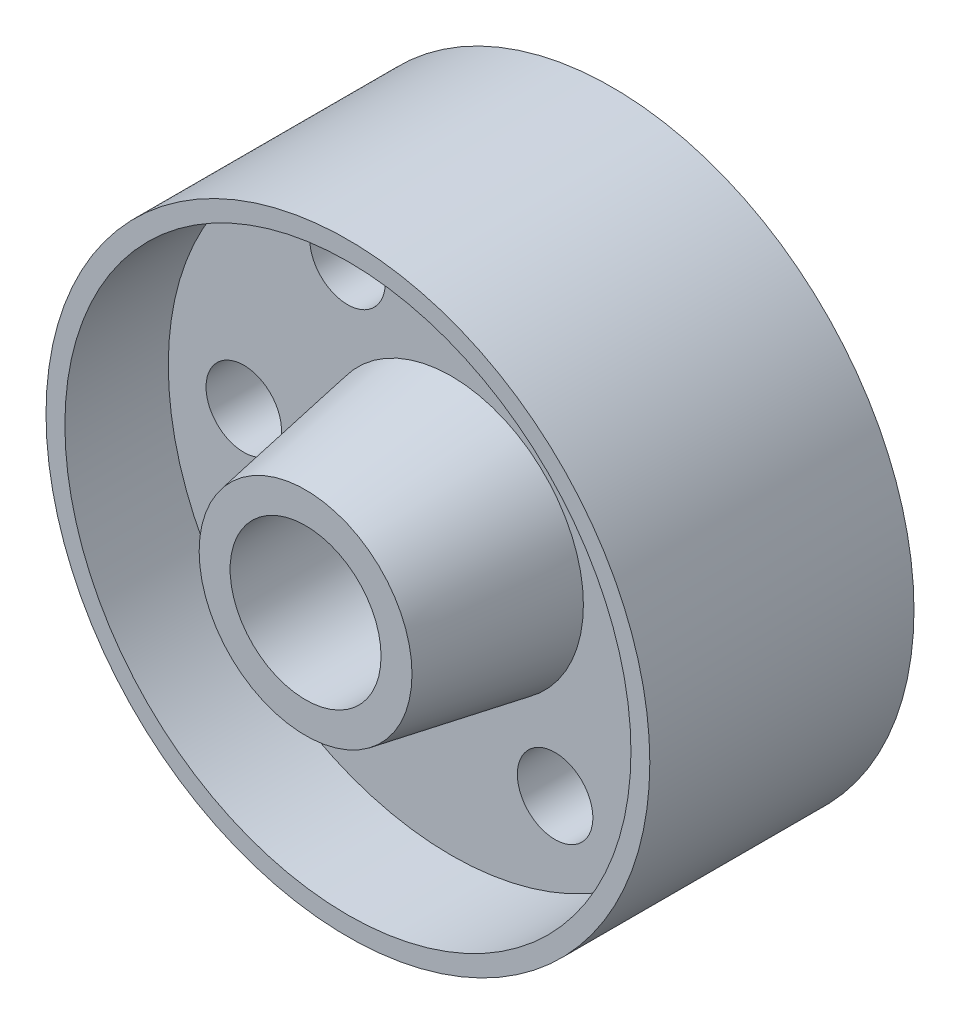
ISO-10303-21;
HEADER;
FILE_DESCRIPTION(('STEP AP214'),'2;1');
FILE_NAME('part.step','',(''),(''),'','','');
FILE_SCHEMA(('AUTOMOTIVE_DESIGN { 1 0 10303 214 1 1 1 1 }'));
ENDSEC;
DATA;
#1=APPLICATION_CONTEXT('core data for automotive mechanical design processes');
#2=APPLICATION_PROTOCOL_DEFINITION('international standard','automotive_design',2000,#1);
#3=PRODUCT_CONTEXT('',#1,'mechanical');
#4=PRODUCT('Part','Part','',(#3));
#5=PRODUCT_RELATED_PRODUCT_CATEGORY('part','',(#4));
#6=PRODUCT_DEFINITION_FORMATION('','',#4);
#7=PRODUCT_DEFINITION_CONTEXT('part definition',#1,'design');
#8=PRODUCT_DEFINITION('design','',#6,#7);
#9=PRODUCT_DEFINITION_SHAPE('','',#8);
#10=(LENGTH_UNIT() NAMED_UNIT(*) SI_UNIT(.MILLI.,.METRE.));
#11=(NAMED_UNIT(*) PLANE_ANGLE_UNIT() SI_UNIT($,.RADIAN.));
#12=(NAMED_UNIT(*) SI_UNIT($,.STERADIAN.) SOLID_ANGLE_UNIT());
#13=UNCERTAINTY_MEASURE_WITH_UNIT(LENGTH_MEASURE(1.E-05),#10,'distance_accuracy_value','');
#14=(GEOMETRIC_REPRESENTATION_CONTEXT(3) GLOBAL_UNCERTAINTY_ASSIGNED_CONTEXT((#13)) GLOBAL_UNIT_ASSIGNED_CONTEXT((#10,
#11,#12)) REPRESENTATION_CONTEXT('',''));
#15=CARTESIAN_POINT('',(0.,0.,0.));
#16=DIRECTION('',(0.,0.,1.));
#17=DIRECTION('',(1.,0.,0.));
#18=AXIS2_PLACEMENT_3D('',#15,#16,#17);
#19=CARTESIAN_POINT('',(0.,12.7,29.3497));
#20=DIRECTION('',(0.,0.,-1.));
#21=DIRECTION('',(-1.,0.,0.));
#22=AXIS2_PLACEMENT_3D('',#19,#20,#21);
#23=PLANE('',#22);
#24=CARTESIAN_POINT('',(0.,0.,29.3497));
#25=DIRECTION('',(0.,0.,1.));
#26=DIRECTION('',(1.,0.,0.));
#27=AXIS2_PLACEMENT_3D('',#24,#25,#26);
#28=CIRCLE('',#27,12.7);
#29=CARTESIAN_POINT('',(12.7,0.,29.3497));
#30=VERTEX_POINT('',#29);
#31=EDGE_CURVE('E10',#30,#30,#28,.T.);
#32=ORIENTED_EDGE('',*,*,#31,.F.);
#33=EDGE_LOOP('',(#32));
#34=FACE_BOUND('',#33,.T.);
#35=CARTESIAN_POINT('',(0.,0.,29.3497));
#36=DIRECTION('',(0.,0.,1.));
#37=DIRECTION('',(1.,0.,0.));
#38=AXIS2_PLACEMENT_3D('',#35,#36,#37);
#39=CIRCLE('',#38,17.907);
#40=CARTESIAN_POINT('',(17.907,0.,29.3497));
#41=VERTEX_POINT('',#40);
#42=EDGE_CURVE('E90',#41,#41,#39,.T.);
#43=ORIENTED_EDGE('',*,*,#42,.T.);
#44=EDGE_LOOP('',(#43));
#45=FACE_BOUND('',#44,.T.);
#46=ADVANCED_FACE('F37',(#34,#45),#23,.F.);
#47=CARTESIAN_POINT('',(0.,0.,50.3328850587005));
#48=DIRECTION('',(0.,0.,1.));
#49=DIRECTION('',(1.,0.,0.));
#50=AXIS2_PLACEMENT_3D('',#47,#48,#49);
#51=CYLINDRICAL_SURFACE('',#50,12.7);
#52=CARTESIAN_POINT('',(0.,0.,-29.3497));
#53=DIRECTION('',(0.,0.,1.));
#54=DIRECTION('',(1.,0.,0.));
#55=AXIS2_PLACEMENT_3D('',#52,#53,#54);
#56=CIRCLE('',#55,12.7);
#57=CARTESIAN_POINT('',(12.7,0.,-29.3497));
#58=VERTEX_POINT('',#57);
#59=EDGE_CURVE('E44',#58,#58,#56,.T.);
#60=ORIENTED_EDGE('',*,*,#59,.F.);
#61=EDGE_LOOP('',(#60));
#62=FACE_BOUND('',#61,.T.);
#63=ORIENTED_EDGE('',*,*,#31,.T.);
#64=EDGE_LOOP('',(#63));
#65=FACE_BOUND('',#64,.T.);
#66=ADVANCED_FACE('F206',(#62,#65),#51,.F.);
#67=CARTESIAN_POINT('',(0.,12.7,-29.3497));
#68=DIRECTION('',(0.,0.,1.));
#69=DIRECTION('',(1.,0.,0.));
#70=AXIS2_PLACEMENT_3D('',#67,#68,#69);
#71=PLANE('',#70);
#72=CARTESIAN_POINT('',(0.,0.,-29.3497));
#73=DIRECTION('',(0.,0.,1.));
#74=DIRECTION('',(1.,0.,0.));
#75=AXIS2_PLACEMENT_3D('',#72,#73,#74);
#76=CIRCLE('',#75,17.907);
#77=CARTESIAN_POINT('',(17.907,0.,-29.3497));
#78=VERTEX_POINT('',#77);
#79=EDGE_CURVE('E50',#78,#78,#76,.T.);
#80=ORIENTED_EDGE('',*,*,#79,.F.);
#81=EDGE_LOOP('',(#80));
#82=FACE_BOUND('',#81,.T.);
#83=ORIENTED_EDGE('',*,*,#59,.T.);
#84=EDGE_LOOP('',(#83));
#85=FACE_BOUND('',#84,.T.);
#86=ADVANCED_FACE('F201',(#82,#85),#71,.F.);
#87=CARTESIAN_POINT('',(0.,0.,-29.3497));
#88=DIRECTION('',(0.,0.,1.));
#89=DIRECTION('',(1.,0.,0.));
#90=AXIS2_PLACEMENT_3D('',#87,#88,#89);
#91=CONICAL_SURFACE('',#90,17.907,0.174288117720068);
#92=CARTESIAN_POINT('',(0.,0.,-4.826));
#93=DIRECTION('',(0.,0.,1.));
#94=DIRECTION('',(1.,0.,0.));
#95=AXIS2_PLACEMENT_3D('',#92,#93,#94);
#96=CIRCLE('',#95,22.225);
#97=CARTESIAN_POINT('',(22.225,0.,-4.826));
#98=VERTEX_POINT('',#97);
#99=EDGE_CURVE('E56',#98,#98,#96,.T.);
#100=ORIENTED_EDGE('',*,*,#99,.F.);
#101=EDGE_LOOP('',(#100));
#102=FACE_BOUND('',#101,.T.);
#103=ORIENTED_EDGE('',*,*,#79,.T.);
#104=EDGE_LOOP('',(#103));
#105=FACE_BOUND('',#104,.T.);
#106=ADVANCED_FACE('F194',(#102,#105),#91,.T.);
#107=CARTESIAN_POINT('',(0.,47.625,-4.826));
#108=DIRECTION('',(0.,0.,1.));
#109=DIRECTION('',(1.,0.,0.));
#110=AXIS2_PLACEMENT_3D('',#107,#108,#109);
#111=PLANE('',#110);
#112=CARTESIAN_POINT('',(17.4625000000004,-30.2459372271713,-4.826));
#113=DIRECTION('',(0.,0.,1.));
#114=DIRECTION('',(0.50000000000001,-0.866025403784433,0.));
#115=AXIS2_PLACEMENT_3D('',#112,#113,#114);
#116=CIRCLE('',#115,6.34999999999999);
#117=CARTESIAN_POINT('',(20.6375000000004,-35.7451985412025,-4.826));
#118=VERTEX_POINT('',#117);
#119=EDGE_CURVE('E111',#118,#118,#116,.T.);
#120=ORIENTED_EDGE('',*,*,#119,.T.);
#121=EDGE_LOOP('',(#120));
#122=FACE_BOUND('',#121,.T.);
#123=CARTESIAN_POINT('',(-17.4624999999997,-30.2459372271717,-4.826));
#124=DIRECTION('',(0.,0.,1.));
#125=DIRECTION('',(-0.499999999999992,-0.866025403784443,0.));
#126=AXIS2_PLACEMENT_3D('',#123,#124,#125);
#127=CIRCLE('',#126,6.34999999999999);
#128=CARTESIAN_POINT('',(-20.6374999999997,-35.7451985412029,-4.826));
#129=VERTEX_POINT('',#128);
#130=EDGE_CURVE('E120',#129,#129,#127,.T.);
#131=ORIENTED_EDGE('',*,*,#130,.T.);
#132=EDGE_LOOP('',(#131));
#133=FACE_BOUND('',#132,.T.);
#134=CARTESIAN_POINT('',(-34.925,0.,-4.826));
#135=DIRECTION('',(0.,0.,1.));
#136=DIRECTION('',(-1.,0.,0.));
#137=AXIS2_PLACEMENT_3D('',#134,#135,#136);
#138=CIRCLE('',#137,6.34999999999999);
#139=CARTESIAN_POINT('',(-41.275,0.,-4.826));
#140=VERTEX_POINT('',#139);
#141=EDGE_CURVE('E128',#140,#140,#138,.T.);
#142=ORIENTED_EDGE('',*,*,#141,.T.);
#143=EDGE_LOOP('',(#142));
#144=FACE_BOUND('',#143,.T.);
#145=CARTESIAN_POINT('',(-17.4625000000001,30.2459372271714,-4.826));
#146=DIRECTION('',(0.,0.,1.));
#147=DIRECTION('',(-0.500000000000004,0.866025403784436,0.));
#148=AXIS2_PLACEMENT_3D('',#145,#146,#147);
#149=CIRCLE('',#148,6.34999999999999);
#150=CARTESIAN_POINT('',(-20.6375000000002,35.7451985412026,-4.826));
#151=VERTEX_POINT('',#150);
#152=EDGE_CURVE('E110',#151,#151,#149,.T.);
#153=ORIENTED_EDGE('',*,*,#152,.T.);
#154=EDGE_LOOP('',(#153));
#155=FACE_BOUND('',#154,.T.);
#156=CARTESIAN_POINT('',(17.4624999999999,30.2459372271716,-4.826));
#157=DIRECTION('',(0.,0.,1.));
#158=DIRECTION('',(0.499999999999998,0.86602540378444,0.));
#159=AXIS2_PLACEMENT_3D('',#156,#157,#158);
#160=CIRCLE('',#159,6.34999999999999);
#161=CARTESIAN_POINT('',(20.6374999999999,35.7451985412027,-4.826));
#162=VERTEX_POINT('',#161);
#163=EDGE_CURVE('E102',#162,#162,#160,.T.);
#164=ORIENTED_EDGE('',*,*,#163,.T.);
#165=EDGE_LOOP('',(#164));
#166=FACE_BOUND('',#165,.T.);
#167=CARTESIAN_POINT('',(34.925,0.,-4.826));
#168=DIRECTION('',(0.,0.,1.));
#169=DIRECTION('',(1.,0.,0.));
#170=AXIS2_PLACEMENT_3D('',#167,#168,#169);
#171=CIRCLE('',#170,6.34999999999999);
#172=CARTESIAN_POINT('',(41.275,0.,-4.826));
#173=VERTEX_POINT('',#172);
#174=EDGE_CURVE('E94',#173,#173,#171,.T.);
#175=ORIENTED_EDGE('',*,*,#174,.T.);
#176=EDGE_LOOP('',(#175));
#177=FACE_BOUND('',#176,.T.);
#178=CARTESIAN_POINT('',(0.,0.,-4.826));
#179=DIRECTION('',(0.,0.,1.));
#180=DIRECTION('',(1.,0.,0.));
#181=AXIS2_PLACEMENT_3D('',#178,#179,#180);
#182=CIRCLE('',#181,47.625);
#183=CARTESIAN_POINT('',(47.625,0.,-4.826));
#184=VERTEX_POINT('',#183);
#185=EDGE_CURVE('E62',#184,#184,#182,.T.);
#186=ORIENTED_EDGE('',*,*,#185,.F.);
#187=EDGE_LOOP('',(#186));
#188=FACE_BOUND('',#187,.T.);
#189=ORIENTED_EDGE('',*,*,#99,.T.);
#190=EDGE_LOOP('',(#189));
#191=FACE_BOUND('',#190,.T.);
#192=ADVANCED_FACE('F188',(#122,#133,#144,#155,#166,#177,#188,#191),#111,.F.);
#193=CARTESIAN_POINT('',(0.,0.,50.3328850587005));
#194=DIRECTION('',(0.,0.,1.));
#195=DIRECTION('',(1.,0.,0.));
#196=AXIS2_PLACEMENT_3D('',#193,#194,#195);
#197=CYLINDRICAL_SURFACE('',#196,47.625);
#198=CARTESIAN_POINT('',(0.,0.,-22.225));
#199=DIRECTION('',(0.,0.,1.));
#200=DIRECTION('',(1.,0.,0.));
#201=AXIS2_PLACEMENT_3D('',#198,#199,#200);
#202=CIRCLE('',#201,47.625);
#203=CARTESIAN_POINT('',(47.625,0.,-22.225));
#204=VERTEX_POINT('',#203);
#205=EDGE_CURVE('E66',#204,#204,#202,.T.);
#206=ORIENTED_EDGE('',*,*,#205,.F.);
#207=EDGE_LOOP('',(#206));
#208=FACE_BOUND('',#207,.T.);
#209=ORIENTED_EDGE('',*,*,#185,.T.);
#210=EDGE_LOOP('',(#209));
#211=FACE_BOUND('',#210,.T.);
#212=ADVANCED_FACE('F182',(#208,#211),#197,.F.);
#213=CARTESIAN_POINT('',(0.,50.8,-22.225));
#214=DIRECTION('',(0.,0.,1.));
#215=DIRECTION('',(1.,0.,0.));
#216=AXIS2_PLACEMENT_3D('',#213,#214,#215);
#217=PLANE('',#216);
#218=CARTESIAN_POINT('',(0.,0.,-22.225));
#219=DIRECTION('',(0.,0.,1.));
#220=DIRECTION('',(1.,0.,0.));
#221=AXIS2_PLACEMENT_3D('',#218,#219,#220);
#222=CIRCLE('',#221,50.8);
#223=CARTESIAN_POINT('',(50.8,0.,-22.225));
#224=VERTEX_POINT('',#223);
#225=EDGE_CURVE('E70',#224,#224,#222,.T.);
#226=ORIENTED_EDGE('',*,*,#225,.F.);
#227=EDGE_LOOP('',(#226));
#228=FACE_BOUND('',#227,.T.);
#229=ORIENTED_EDGE('',*,*,#205,.T.);
#230=EDGE_LOOP('',(#229));
#231=FACE_BOUND('',#230,.T.);
#232=ADVANCED_FACE('F176',(#228,#231),#217,.F.);
#233=CARTESIAN_POINT('',(0.,0.,50.3328850587005));
#234=DIRECTION('',(0.,0.,1.));
#235=DIRECTION('',(1.,0.,0.));
#236=AXIS2_PLACEMENT_3D('',#233,#234,#235);
#237=CYLINDRICAL_SURFACE('',#236,50.8);
#238=CARTESIAN_POINT('',(0.,0.,22.225));
#239=DIRECTION('',(0.,0.,1.));
#240=DIRECTION('',(1.,0.,0.));
#241=AXIS2_PLACEMENT_3D('',#238,#239,#240);
#242=CIRCLE('',#241,50.8);
#243=CARTESIAN_POINT('',(50.8,0.,22.225));
#244=VERTEX_POINT('',#243);
#245=EDGE_CURVE('E74',#244,#244,#242,.T.);
#246=ORIENTED_EDGE('',*,*,#245,.F.);
#247=EDGE_LOOP('',(#246));
#248=FACE_BOUND('',#247,.T.);
#249=ORIENTED_EDGE('',*,*,#225,.T.);
#250=EDGE_LOOP('',(#249));
#251=FACE_BOUND('',#250,.T.);
#252=ADVANCED_FACE('F170',(#248,#251),#237,.T.);
#253=CARTESIAN_POINT('',(0.,47.625,22.225));
#254=DIRECTION('',(0.,0.,-1.));
#255=DIRECTION('',(-1.,0.,0.));
#256=AXIS2_PLACEMENT_3D('',#253,#254,#255);
#257=PLANE('',#256);
#258=CARTESIAN_POINT('',(0.,0.,22.225));
#259=DIRECTION('',(0.,0.,1.));
#260=DIRECTION('',(1.,0.,0.));
#261=AXIS2_PLACEMENT_3D('',#258,#259,#260);
#262=CIRCLE('',#261,47.625);
#263=CARTESIAN_POINT('',(47.625,0.,22.225));
#264=VERTEX_POINT('',#263);
#265=EDGE_CURVE('E78',#264,#264,#262,.T.);
#266=ORIENTED_EDGE('',*,*,#265,.F.);
#267=EDGE_LOOP('',(#266));
#268=FACE_BOUND('',#267,.T.);
#269=ORIENTED_EDGE('',*,*,#245,.T.);
#270=EDGE_LOOP('',(#269));
#271=FACE_BOUND('',#270,.T.);
#272=ADVANCED_FACE('F164',(#268,#271),#257,.F.);
#273=CARTESIAN_POINT('',(0.,0.,50.3328850587005));
#274=DIRECTION('',(0.,0.,1.));
#275=DIRECTION('',(1.,0.,0.));
#276=AXIS2_PLACEMENT_3D('',#273,#274,#275);
#277=CYLINDRICAL_SURFACE('',#276,47.625);
#278=CARTESIAN_POINT('',(0.,0.,4.826));
#279=DIRECTION('',(0.,0.,1.));
#280=DIRECTION('',(1.,0.,0.));
#281=AXIS2_PLACEMENT_3D('',#278,#279,#280);
#282=CIRCLE('',#281,47.625);
#283=CARTESIAN_POINT('',(47.625,0.,4.826));
#284=VERTEX_POINT('',#283);
#285=EDGE_CURVE('E82',#284,#284,#282,.T.);
#286=ORIENTED_EDGE('',*,*,#285,.F.);
#287=EDGE_LOOP('',(#286));
#288=FACE_BOUND('',#287,.T.);
#289=ORIENTED_EDGE('',*,*,#265,.T.);
#290=EDGE_LOOP('',(#289));
#291=FACE_BOUND('',#290,.T.);
#292=ADVANCED_FACE('F151',(#288,#291),#277,.F.);
#293=CARTESIAN_POINT('',(0.,22.2250000000001,4.826));
#294=DIRECTION('',(0.,0.,-1.));
#295=DIRECTION('',(-1.,0.,0.));
#296=AXIS2_PLACEMENT_3D('',#293,#294,#295);
#297=PLANE('',#296);
#298=CARTESIAN_POINT('',(17.4625000000004,-30.2459372271713,4.826));
#299=DIRECTION('',(0.,0.,1.));
#300=DIRECTION('',(0.50000000000001,-0.866025403784433,0.));
#301=AXIS2_PLACEMENT_3D('',#298,#299,#300);
#302=CIRCLE('',#301,6.34999999999999);
#303=CARTESIAN_POINT('',(20.6375000000004,-35.7451985412024,4.826));
#304=VERTEX_POINT('',#303);
#305=EDGE_CURVE('E116',#304,#304,#302,.T.);
#306=ORIENTED_EDGE('',*,*,#305,.F.);
#307=EDGE_LOOP('',(#306));
#308=FACE_BOUND('',#307,.T.);
#309=CARTESIAN_POINT('',(-17.4624999999997,-30.2459372271717,4.826));
#310=DIRECTION('',(0.,0.,1.));
#311=DIRECTION('',(-0.499999999999992,-0.866025403784443,0.));
#312=AXIS2_PLACEMENT_3D('',#309,#310,#311);
#313=CIRCLE('',#312,6.34999999999999);
#314=CARTESIAN_POINT('',(-20.6374999999997,-35.7451985412029,4.826));
#315=VERTEX_POINT('',#314);
#316=EDGE_CURVE('E115',#315,#315,#313,.T.);
#317=ORIENTED_EDGE('',*,*,#316,.F.);
#318=EDGE_LOOP('',(#317));
#319=FACE_BOUND('',#318,.T.);
#320=CARTESIAN_POINT('',(-34.925,0.,4.826));
#321=DIRECTION('',(0.,0.,1.));
#322=DIRECTION('',(-1.,0.,0.));
#323=AXIS2_PLACEMENT_3D('',#320,#321,#322);
#324=CIRCLE('',#323,6.34999999999999);
#325=CARTESIAN_POINT('',(-41.275,0.,4.826));
#326=VERTEX_POINT('',#325);
#327=EDGE_CURVE('E124',#326,#326,#324,.T.);
#328=ORIENTED_EDGE('',*,*,#327,.F.);
#329=EDGE_LOOP('',(#328));
#330=FACE_BOUND('',#329,.T.);
#331=CARTESIAN_POINT('',(-17.4625000000001,30.2459372271714,4.826));
#332=DIRECTION('',(0.,0.,1.));
#333=DIRECTION('',(-0.500000000000004,0.866025403784436,0.));
#334=AXIS2_PLACEMENT_3D('',#331,#332,#333);
#335=CIRCLE('',#334,6.34999999999999);
#336=CARTESIAN_POINT('',(-20.6375000000002,35.7451985412026,4.826));
#337=VERTEX_POINT('',#336);
#338=EDGE_CURVE('E132',#337,#337,#335,.T.);
#339=ORIENTED_EDGE('',*,*,#338,.F.);
#340=EDGE_LOOP('',(#339));
#341=FACE_BOUND('',#340,.T.);
#342=CARTESIAN_POINT('',(17.4624999999999,30.2459372271716,4.826));
#343=DIRECTION('',(0.,0.,1.));
#344=DIRECTION('',(0.499999999999998,0.86602540378444,0.));
#345=AXIS2_PLACEMENT_3D('',#342,#343,#344);
#346=CIRCLE('',#345,6.34999999999999);
#347=CARTESIAN_POINT('',(20.6374999999999,35.7451985412027,4.826));
#348=VERTEX_POINT('',#347);
#349=EDGE_CURVE('E106',#348,#348,#346,.T.);
#350=ORIENTED_EDGE('',*,*,#349,.F.);
#351=EDGE_LOOP('',(#350));
#352=FACE_BOUND('',#351,.T.);
#353=CARTESIAN_POINT('',(34.925,0.,4.826));
#354=DIRECTION('',(0.,0.,1.));
#355=DIRECTION('',(1.,0.,0.));
#356=AXIS2_PLACEMENT_3D('',#353,#354,#355);
#357=CIRCLE('',#356,6.34999999999999);
#358=CARTESIAN_POINT('',(41.275,0.,4.826));
#359=VERTEX_POINT('',#358);
#360=EDGE_CURVE('E98',#359,#359,#357,.T.);
#361=ORIENTED_EDGE('',*,*,#360,.F.);
#362=EDGE_LOOP('',(#361));
#363=FACE_BOUND('',#362,.T.);
#364=CARTESIAN_POINT('',(0.,0.,4.826));
#365=DIRECTION('',(0.,0.,1.));
#366=DIRECTION('',(1.,0.,0.));
#367=AXIS2_PLACEMENT_3D('',#364,#365,#366);
#368=CIRCLE('',#367,22.2250000000001);
#369=CARTESIAN_POINT('',(22.2250000000001,0.,4.826));
#370=VERTEX_POINT('',#369);
#371=EDGE_CURVE('E86',#370,#370,#368,.T.);
#372=ORIENTED_EDGE('',*,*,#371,.F.);
#373=EDGE_LOOP('',(#372));
#374=FACE_BOUND('',#373,.T.);
#375=ORIENTED_EDGE('',*,*,#285,.T.);
#376=EDGE_LOOP('',(#375));
#377=FACE_BOUND('',#376,.T.);
#378=ADVANCED_FACE('F147',(#308,#319,#330,#341,#352,#363,#374,#377),#297,.F.);
#379=CARTESIAN_POINT('',(0.,0.,4.826));
#380=DIRECTION('',(0.,0.,-1.));
#381=DIRECTION('',(-1.,0.,0.));
#382=AXIS2_PLACEMENT_3D('',#379,#380,#381);
#383=CONICAL_SURFACE('',#382,22.2250000000001,0.17428811772007);
#384=ORIENTED_EDGE('',*,*,#42,.F.);
#385=EDGE_LOOP('',(#384));
#386=FACE_BOUND('',#385,.T.);
#387=ORIENTED_EDGE('',*,*,#371,.T.);
#388=EDGE_LOOP('',(#387));
#389=FACE_BOUND('',#388,.T.);
#390=ADVANCED_FACE('F150',(#386,#389),#383,.T.);
#391=CARTESIAN_POINT('',(34.925,0.,4.826));
#392=DIRECTION('',(0.,0.,1.));
#393=DIRECTION('',(1.,0.,0.));
#394=AXIS2_PLACEMENT_3D('',#391,#392,#393);
#395=CYLINDRICAL_SURFACE('',#394,6.34999999999999);
#396=ORIENTED_EDGE('',*,*,#360,.T.);
#397=EDGE_LOOP('',(#396));
#398=FACE_BOUND('',#397,.T.);
#399=ORIENTED_EDGE('',*,*,#174,.F.);
#400=EDGE_LOOP('',(#399));
#401=FACE_BOUND('',#400,.T.);
#402=ADVANCED_FACE('F221',(#398,#401),#395,.F.);
#403=CARTESIAN_POINT('',(17.4624999999999,30.2459372271716,4.826));
#404=DIRECTION('',(0.,0.,1.));
#405=DIRECTION('',(0.499999999999998,0.86602540378444,0.));
#406=AXIS2_PLACEMENT_3D('',#403,#404,#405);
#407=CYLINDRICAL_SURFACE('',#406,6.34999999999999);
#408=ORIENTED_EDGE('',*,*,#349,.T.);
#409=EDGE_LOOP('',(#408));
#410=FACE_BOUND('',#409,.T.);
#411=ORIENTED_EDGE('',*,*,#163,.F.);
#412=EDGE_LOOP('',(#411));
#413=FACE_BOUND('',#412,.T.);
#414=ADVANCED_FACE('F226',(#410,#413),#407,.F.);
#415=CARTESIAN_POINT('',(-17.4625000000001,30.2459372271714,4.826));
#416=DIRECTION('',(0.,0.,1.));
#417=DIRECTION('',(-0.500000000000004,0.866025403784436,0.));
#418=AXIS2_PLACEMENT_3D('',#415,#416,#417);
#419=CYLINDRICAL_SURFACE('',#418,6.34999999999999);
#420=ORIENTED_EDGE('',*,*,#338,.T.);
#421=EDGE_LOOP('',(#420));
#422=FACE_BOUND('',#421,.T.);
#423=ORIENTED_EDGE('',*,*,#152,.F.);
#424=EDGE_LOOP('',(#423));
#425=FACE_BOUND('',#424,.T.);
#426=ADVANCED_FACE('F144',(#422,#425),#419,.F.);
#427=CARTESIAN_POINT('',(-34.925,0.,4.826));
#428=DIRECTION('',(0.,0.,1.));
#429=DIRECTION('',(-1.,0.,0.));
#430=AXIS2_PLACEMENT_3D('',#427,#428,#429);
#431=CYLINDRICAL_SURFACE('',#430,6.34999999999999);
#432=ORIENTED_EDGE('',*,*,#327,.T.);
#433=EDGE_LOOP('',(#432));
#434=FACE_BOUND('',#433,.T.);
#435=ORIENTED_EDGE('',*,*,#141,.F.);
#436=EDGE_LOOP('',(#435));
#437=FACE_BOUND('',#436,.T.);
#438=ADVANCED_FACE('F240',(#434,#437),#431,.F.);
#439=CARTESIAN_POINT('',(-17.4624999999997,-30.2459372271717,4.826));
#440=DIRECTION('',(0.,0.,1.));
#441=DIRECTION('',(-0.499999999999992,-0.866025403784443,0.));
#442=AXIS2_PLACEMENT_3D('',#439,#440,#441);
#443=CYLINDRICAL_SURFACE('',#442,6.34999999999999);
#444=ORIENTED_EDGE('',*,*,#316,.T.);
#445=EDGE_LOOP('',(#444));
#446=FACE_BOUND('',#445,.T.);
#447=ORIENTED_EDGE('',*,*,#130,.F.);
#448=EDGE_LOOP('',(#447));
#449=FACE_BOUND('',#448,.T.);
#450=ADVANCED_FACE('F236',(#446,#449),#443,.F.);
#451=CARTESIAN_POINT('',(17.4625000000004,-30.2459372271713,4.826));
#452=DIRECTION('',(0.,0.,1.));
#453=DIRECTION('',(0.50000000000001,-0.866025403784433,0.));
#454=AXIS2_PLACEMENT_3D('',#451,#452,#453);
#455=CYLINDRICAL_SURFACE('',#454,6.34999999999999);
#456=ORIENTED_EDGE('',*,*,#305,.T.);
#457=EDGE_LOOP('',(#456));
#458=FACE_BOUND('',#457,.T.);
#459=ORIENTED_EDGE('',*,*,#119,.F.);
#460=EDGE_LOOP('',(#459));
#461=FACE_BOUND('',#460,.T.);
#462=ADVANCED_FACE('F233',(#458,#461),#455,.F.);
#463=CLOSED_SHELL('',(#46,#66,#86,#106,#192,#212,#232,#252,#272,#292,#378,#390,#402,#414,#426,
#438,#450,#462));
#464=MANIFOLD_SOLID_BREP('B2',#463);
#465=ADVANCED_BREP_SHAPE_REPRESENTATION('',(#18,#464),#14);
#466=SHAPE_DEFINITION_REPRESENTATION(#9,#465);
ENDSEC;
END-ISO-10303-21;
